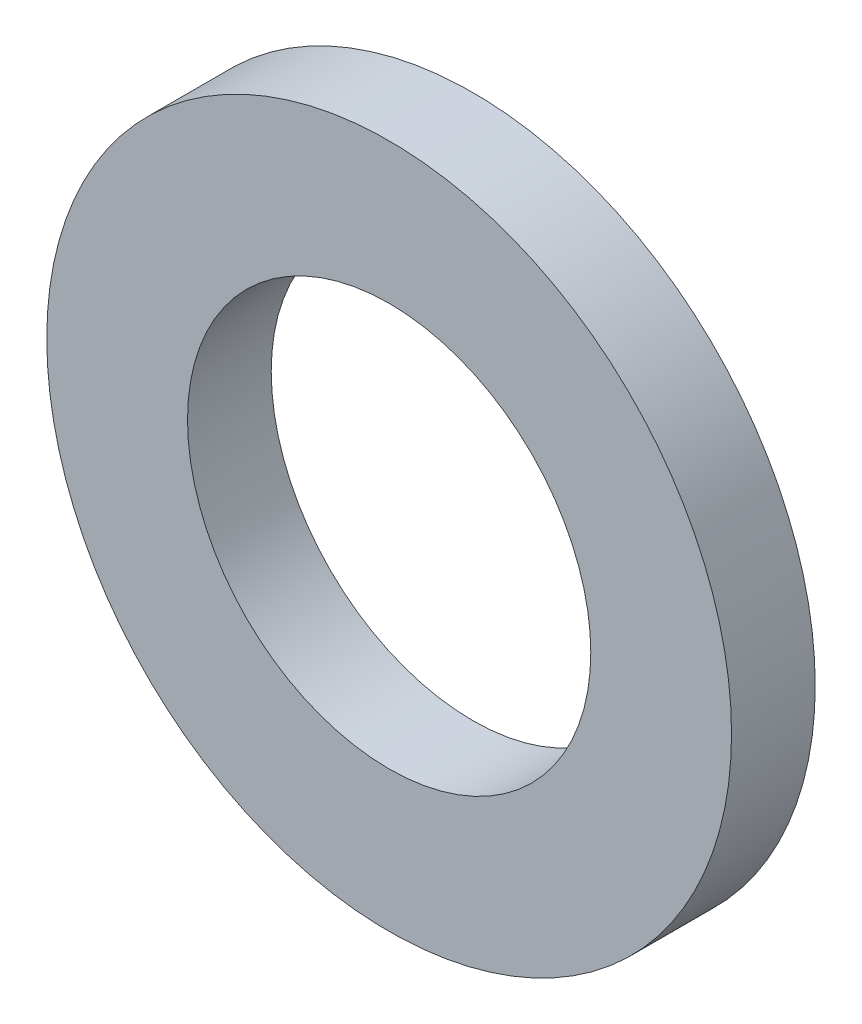
ISO-10303-21;
HEADER;
FILE_DESCRIPTION(('STEP AP214'),'2;1');
FILE_NAME('part.step','',(''),(''),'','','');
FILE_SCHEMA(('AUTOMOTIVE_DESIGN { 1 0 10303 214 1 1 1 1 }'));
ENDSEC;
DATA;
#1=APPLICATION_CONTEXT('core data for automotive mechanical design processes');
#2=APPLICATION_PROTOCOL_DEFINITION('international standard','automotive_design',2000,#1);
#3=PRODUCT_CONTEXT('',#1,'mechanical');
#4=PRODUCT('Part','Part','',(#3));
#5=PRODUCT_RELATED_PRODUCT_CATEGORY('part','',(#4));
#6=PRODUCT_DEFINITION_FORMATION('','',#4);
#7=PRODUCT_DEFINITION_CONTEXT('part definition',#1,'design');
#8=PRODUCT_DEFINITION('design','',#6,#7);
#9=PRODUCT_DEFINITION_SHAPE('','',#8);
#10=(LENGTH_UNIT() NAMED_UNIT(*) SI_UNIT(.MILLI.,.METRE.));
#11=(NAMED_UNIT(*) PLANE_ANGLE_UNIT() SI_UNIT($,.RADIAN.));
#12=(NAMED_UNIT(*) SI_UNIT($,.STERADIAN.) SOLID_ANGLE_UNIT());
#13=UNCERTAINTY_MEASURE_WITH_UNIT(LENGTH_MEASURE(1.E-05),#10,'distance_accuracy_value','');
#14=(GEOMETRIC_REPRESENTATION_CONTEXT(3) GLOBAL_UNCERTAINTY_ASSIGNED_CONTEXT((#13)) GLOBAL_UNIT_ASSIGNED_CONTEXT((#10,
#11,#12)) REPRESENTATION_CONTEXT('',''));
#15=CARTESIAN_POINT('',(0.,0.,0.));
#16=DIRECTION('',(0.,0.,1.));
#17=DIRECTION('',(1.,0.,0.));
#18=AXIS2_PLACEMENT_3D('',#15,#16,#17);
#19=CARTESIAN_POINT('',(0.,0.,1.1));
#20=DIRECTION('',(0.,0.,1.));
#21=DIRECTION('',(1.,0.,0.));
#22=AXIS2_PLACEMENT_3D('',#19,#20,#21);
#23=PLANE('',#22);
#24=CARTESIAN_POINT('',(0.,0.,1.1));
#25=DIRECTION('',(0.,0.,1.));
#26=DIRECTION('',(1.,0.,0.));
#27=AXIS2_PLACEMENT_3D('',#24,#25,#26);
#28=CIRCLE('',#27,4.5);
#29=CARTESIAN_POINT('',(4.5,0.,1.1));
#30=VERTEX_POINT('',#29);
#31=EDGE_CURVE('E10',#30,#30,#28,.T.);
#32=ORIENTED_EDGE('',*,*,#31,.T.);
#33=EDGE_LOOP('',(#32));
#34=FACE_BOUND('',#33,.T.);
#35=CARTESIAN_POINT('',(0.,0.,1.1));
#36=DIRECTION('',(0.,0.,1.));
#37=DIRECTION('',(1.,0.,0.));
#38=AXIS2_PLACEMENT_3D('',#35,#36,#37);
#39=CIRCLE('',#38,2.65);
#40=CARTESIAN_POINT('',(2.65,0.,1.1));
#41=VERTEX_POINT('',#40);
#42=EDGE_CURVE('E41',#41,#41,#39,.T.);
#43=ORIENTED_EDGE('',*,*,#42,.F.);
#44=EDGE_LOOP('',(#43));
#45=FACE_BOUND('',#44,.T.);
#46=ADVANCED_FACE('F30',(#34,#45),#23,.T.);
#47=CARTESIAN_POINT('',(0.,0.,0.));
#48=DIRECTION('',(0.,0.,1.));
#49=DIRECTION('',(1.,0.,0.));
#50=AXIS2_PLACEMENT_3D('',#47,#48,#49);
#51=PLANE('',#50);
#52=CARTESIAN_POINT('',(0.,0.,0.));
#53=DIRECTION('',(0.,0.,1.));
#54=DIRECTION('',(1.,0.,0.));
#55=AXIS2_PLACEMENT_3D('',#52,#53,#54);
#56=CIRCLE('',#55,4.5);
#57=CARTESIAN_POINT('',(4.5,0.,0.));
#58=VERTEX_POINT('',#57);
#59=EDGE_CURVE('E34',#58,#58,#56,.T.);
#60=ORIENTED_EDGE('',*,*,#59,.F.);
#61=EDGE_LOOP('',(#60));
#62=FACE_BOUND('',#61,.T.);
#63=CARTESIAN_POINT('',(0.,0.,0.));
#64=DIRECTION('',(0.,0.,1.));
#65=DIRECTION('',(1.,0.,0.));
#66=AXIS2_PLACEMENT_3D('',#63,#64,#65);
#67=CIRCLE('',#66,2.65);
#68=CARTESIAN_POINT('',(2.65,0.,0.));
#69=VERTEX_POINT('',#68);
#70=EDGE_CURVE('E43',#69,#69,#67,.T.);
#71=ORIENTED_EDGE('',*,*,#70,.T.);
#72=EDGE_LOOP('',(#71));
#73=FACE_BOUND('',#72,.T.);
#74=ADVANCED_FACE('F53',(#62,#73),#51,.F.);
#75=CARTESIAN_POINT('',(0.,0.,1.1));
#76=DIRECTION('',(0.,0.,-1.));
#77=DIRECTION('',(-1.,0.,0.));
#78=AXIS2_PLACEMENT_3D('',#75,#76,#77);
#79=CYLINDRICAL_SURFACE('',#78,4.5);
#80=ORIENTED_EDGE('',*,*,#31,.F.);
#81=EDGE_LOOP('',(#80));
#82=FACE_BOUND('',#81,.T.);
#83=ORIENTED_EDGE('',*,*,#59,.T.);
#84=EDGE_LOOP('',(#83));
#85=FACE_BOUND('',#84,.T.);
#86=ADVANCED_FACE('F32',(#82,#85),#79,.T.);
#87=CARTESIAN_POINT('',(0.,0.,1.1));
#88=DIRECTION('',(0.,0.,-1.));
#89=DIRECTION('',(-1.,0.,0.));
#90=AXIS2_PLACEMENT_3D('',#87,#88,#89);
#91=CYLINDRICAL_SURFACE('',#90,2.65);
#92=ORIENTED_EDGE('',*,*,#42,.T.);
#93=EDGE_LOOP('',(#92));
#94=FACE_BOUND('',#93,.T.);
#95=ORIENTED_EDGE('',*,*,#70,.F.);
#96=EDGE_LOOP('',(#95));
#97=FACE_BOUND('',#96,.T.);
#98=ADVANCED_FACE('F49',(#94,#97),#91,.F.);
#99=CLOSED_SHELL('',(#46,#74,#86,#98));
#100=MANIFOLD_SOLID_BREP('B2',#99);
#101=ADVANCED_BREP_SHAPE_REPRESENTATION('',(#18,#100),#14);
#102=SHAPE_DEFINITION_REPRESENTATION(#9,#101);
ENDSEC;
END-ISO-10303-21;
